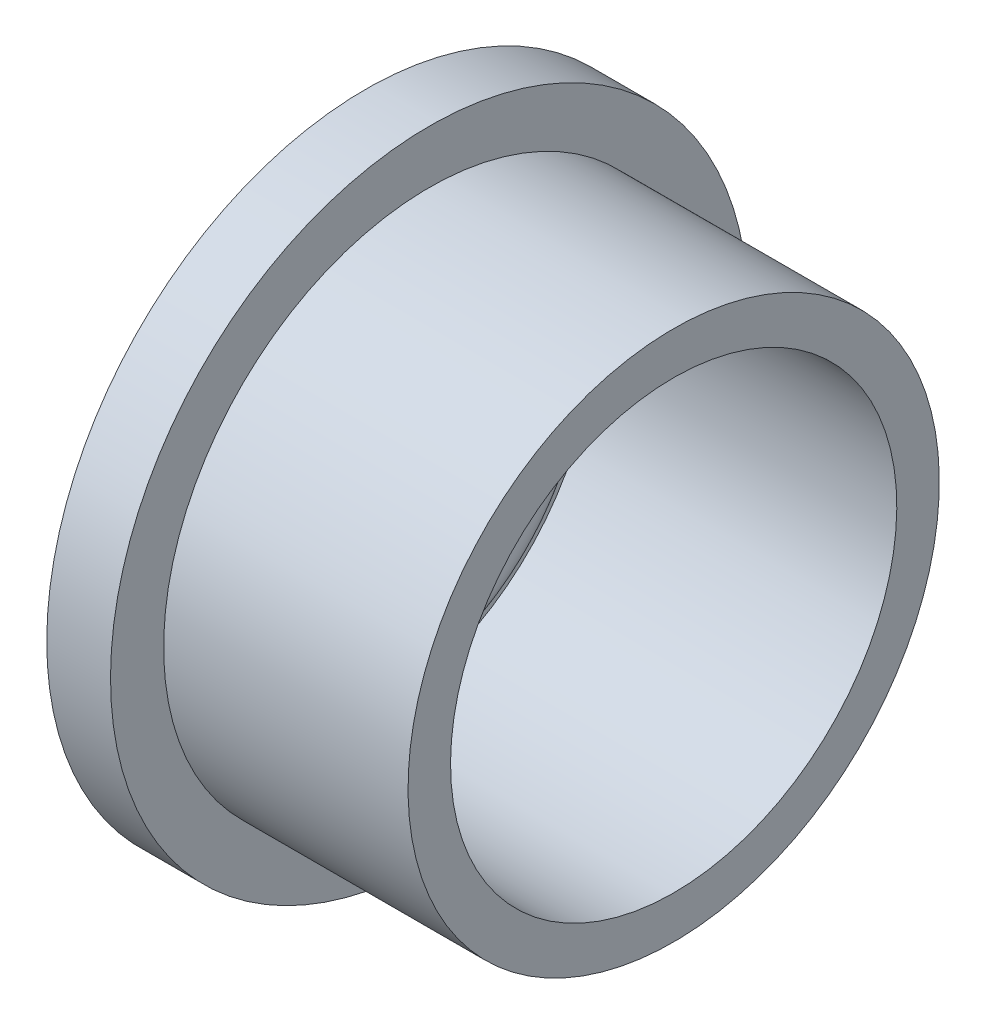
ISO-10303-21;
HEADER;
FILE_DESCRIPTION(('STEP AP214'),'2;1');
FILE_NAME('part.step','',(''),(''),'','','');
FILE_SCHEMA(('AUTOMOTIVE_DESIGN { 1 0 10303 214 1 1 1 1 }'));
ENDSEC;
DATA;
#1=APPLICATION_CONTEXT('core data for automotive mechanical design processes');
#2=APPLICATION_PROTOCOL_DEFINITION('international standard','automotive_design',2000,#1);
#3=PRODUCT_CONTEXT('',#1,'mechanical');
#4=PRODUCT('Part','Part','',(#3));
#5=PRODUCT_RELATED_PRODUCT_CATEGORY('part','',(#4));
#6=PRODUCT_DEFINITION_FORMATION('','',#4);
#7=PRODUCT_DEFINITION_CONTEXT('part definition',#1,'design');
#8=PRODUCT_DEFINITION('design','',#6,#7);
#9=PRODUCT_DEFINITION_SHAPE('','',#8);
#10=(LENGTH_UNIT() NAMED_UNIT(*) SI_UNIT(.MILLI.,.METRE.));
#11=(NAMED_UNIT(*) PLANE_ANGLE_UNIT() SI_UNIT($,.RADIAN.));
#12=(NAMED_UNIT(*) SI_UNIT($,.STERADIAN.) SOLID_ANGLE_UNIT());
#13=UNCERTAINTY_MEASURE_WITH_UNIT(LENGTH_MEASURE(1.E-05),#10,'distance_accuracy_value','');
#14=(GEOMETRIC_REPRESENTATION_CONTEXT(3) GLOBAL_UNCERTAINTY_ASSIGNED_CONTEXT((#13)) GLOBAL_UNIT_ASSIGNED_CONTEXT((#10,
#11,#12)) REPRESENTATION_CONTEXT('',''));
#15=CARTESIAN_POINT('',(0.,0.,0.));
#16=DIRECTION('',(0.,0.,1.));
#17=DIRECTION('',(1.,0.,0.));
#18=AXIS2_PLACEMENT_3D('',#15,#16,#17);
#19=CARTESIAN_POINT('',(7.45,42.9,120.969863647503));
#20=DIRECTION('',(1.,0.,0.));
#21=DIRECTION('',(0.,-0.948451293798745,-0.316922929576715));
#22=AXIS2_PLACEMENT_3D('',#19,#20,#21);
#23=CYLINDRICAL_SURFACE('',#22,1.9);
#24=CARTESIAN_POINT('',(6.,42.9,120.969863647503));
#25=DIRECTION('',(1.,0.,0.));
#26=DIRECTION('',(0.,-0.948451293798745,-0.316922929576715));
#27=AXIS2_PLACEMENT_3D('',#24,#25,#26);
#28=CIRCLE('',#27,1.9);
#29=CARTESIAN_POINT('',(6.,41.0979425417824,120.367710081307));
#30=VERTEX_POINT('',#29);
#31=EDGE_CURVE('E123',#30,#30,#28,.T.);
#32=ORIENTED_EDGE('',*,*,#31,.F.);
#33=EDGE_LOOP('',(#32));
#34=FACE_BOUND('',#33,.T.);
#35=CARTESIAN_POINT('',(6.05,42.9,120.969863647503));
#36=DIRECTION('',(1.,0.,0.));
#37=DIRECTION('',(0.,-0.948451293798745,-0.316922929576715));
#38=AXIS2_PLACEMENT_3D('',#35,#36,#37);
#39=CIRCLE('',#38,1.9);
#40=CARTESIAN_POINT('',(6.05,41.0979425417824,120.367710081307));
#41=VERTEX_POINT('',#40);
#42=EDGE_CURVE('E11',#41,#41,#39,.T.);
#43=ORIENTED_EDGE('',*,*,#42,.T.);
#44=EDGE_LOOP('',(#43));
#45=FACE_BOUND('',#44,.T.);
#46=ADVANCED_FACE('F39',(#34,#45),#23,.F.);
#47=CARTESIAN_POINT('',(6.05,42.9,120.969863647503));
#48=DIRECTION('',(1.,0.,0.));
#49=DIRECTION('',(0.,-0.948451293798745,-0.316922929576715));
#50=AXIS2_PLACEMENT_3D('',#47,#48,#49);
#51=TOROIDAL_SURFACE('',#50,1.8,0.1);
#52=ORIENTED_EDGE('',*,*,#42,.F.);
#53=EDGE_LOOP('',(#52));
#54=FACE_BOUND('',#53,.T.);
#55=CARTESIAN_POINT('',(6.05,42.9,120.969863647503));
#56=DIRECTION('',(1.,0.,0.));
#57=DIRECTION('',(0.,-0.948451293798745,-0.316922929576715));
#58=AXIS2_PLACEMENT_3D('',#55,#56,#57);
#59=CIRCLE('',#58,1.7);
#60=CARTESIAN_POINT('',(6.05,41.2876328005421,120.431094667223));
#61=VERTEX_POINT('',#60);
#62=EDGE_CURVE('E50',#61,#61,#59,.T.);
#63=ORIENTED_EDGE('',*,*,#62,.T.);
#64=EDGE_LOOP('',(#63));
#65=FACE_BOUND('',#64,.T.);
#66=ADVANCED_FACE('F183',(#54,#65),#51,.F.);
#67=CARTESIAN_POINT('',(7.45,42.9,120.969863647503));
#68=DIRECTION('',(1.,0.,0.));
#69=DIRECTION('',(0.,-0.948451293798745,-0.316922929576715));
#70=AXIS2_PLACEMENT_3D('',#67,#68,#69);
#71=CYLINDRICAL_SURFACE('',#70,1.7);
#72=ORIENTED_EDGE('',*,*,#62,.F.);
#73=EDGE_LOOP('',(#72));
#74=FACE_BOUND('',#73,.T.);
#75=CARTESIAN_POINT('',(6.,42.9,120.969863647503));
#76=DIRECTION('',(1.,0.,0.));
#77=DIRECTION('',(0.,-0.948451293798745,-0.316922929576715));
#78=AXIS2_PLACEMENT_3D('',#75,#76,#77);
#79=CIRCLE('',#78,1.7);
#80=CARTESIAN_POINT('',(6.,41.2876328005421,120.431094667223));
#81=VERTEX_POINT('',#80);
#82=EDGE_CURVE('E129',#81,#81,#79,.T.);
#83=ORIENTED_EDGE('',*,*,#82,.T.);
#84=EDGE_LOOP('',(#83));
#85=FACE_BOUND('',#84,.T.);
#86=ADVANCED_FACE('F189',(#74,#85),#71,.T.);
#87=CARTESIAN_POINT('',(6.,44.5123671994579,121.508632627783));
#88=DIRECTION('',(1.,0.,0.));
#89=DIRECTION('',(0.,-0.948451293798745,-0.316922929576715));
#90=AXIS2_PLACEMENT_3D('',#87,#88,#89);
#91=PLANE('',#90);
#92=CARTESIAN_POINT('',(6.,42.9,120.969863647503));
#93=DIRECTION('',(1.,0.,0.));
#94=DIRECTION('',(0.,-0.948451293798745,-0.316922929576715));
#95=AXIS2_PLACEMENT_3D('',#92,#93,#94);
#96=CIRCLE('',#95,1.45);
#97=CARTESIAN_POINT('',(6.,41.5247456239918,120.510325399617));
#98=VERTEX_POINT('',#97);
#99=EDGE_CURVE('E131',#98,#98,#96,.T.);
#100=ORIENTED_EDGE('',*,*,#99,.T.);
#101=EDGE_LOOP('',(#100));
#102=FACE_BOUND('',#101,.T.);
#103=ORIENTED_EDGE('',*,*,#82,.F.);
#104=EDGE_LOOP('',(#103));
#105=FACE_BOUND('',#104,.T.);
#106=ADVANCED_FACE('F200',(#102,#105),#91,.F.);
#107=CARTESIAN_POINT('',(7.45,42.9,120.969863647503));
#108=DIRECTION('',(1.,0.,0.));
#109=DIRECTION('',(0.,-0.948451293798745,-0.316922929576715));
#110=AXIS2_PLACEMENT_3D('',#107,#108,#109);
#111=CYLINDRICAL_SURFACE('',#110,1.45);
#112=ORIENTED_EDGE('',*,*,#99,.F.);
#113=EDGE_LOOP('',(#112));
#114=FACE_BOUND('',#113,.T.);
#115=CARTESIAN_POINT('',(6.05,42.9,120.969863647503));
#116=DIRECTION('',(1.,0.,0.));
#117=DIRECTION('',(0.,-0.948451293798745,-0.316922929576715));
#118=AXIS2_PLACEMENT_3D('',#115,#116,#117);
#119=CIRCLE('',#118,1.45);
#120=CARTESIAN_POINT('',(6.05,41.5247456239918,120.510325399617));
#121=VERTEX_POINT('',#120);
#122=EDGE_CURVE('E120',#121,#121,#119,.T.);
#123=ORIENTED_EDGE('',*,*,#122,.T.);
#124=EDGE_LOOP('',(#123));
#125=FACE_BOUND('',#124,.T.);
#126=ADVANCED_FACE('F41',(#114,#125),#111,.F.);
#127=CARTESIAN_POINT('',(6.05,44.4649446347679,121.492786481305));
#128=DIRECTION('',(-1.,0.,0.));
#129=DIRECTION('',(0.,-0.316922929576715,0.948451293798745));
#130=AXIS2_PLACEMENT_3D('',#127,#128,#129);
#131=PLANE('',#130);
#132=ORIENTED_EDGE('',*,*,#122,.F.);
#133=EDGE_LOOP('',(#132));
#134=FACE_BOUND('',#133,.T.);
#135=CARTESIAN_POINT('',(6.05,42.9,120.969863647503));
#136=DIRECTION('',(1.,0.,0.));
#137=DIRECTION('',(0.,-0.948451293798745,-0.316922929576715));
#138=AXIS2_PLACEMENT_3D('',#135,#136,#137);
#139=CIRCLE('',#138,1.65);
#140=CARTESIAN_POINT('',(6.05,41.3350553652321,120.446940813701));
#141=VERTEX_POINT('',#140);
#142=EDGE_CURVE('E104',#141,#141,#139,.T.);
#143=ORIENTED_EDGE('',*,*,#142,.T.);
#144=EDGE_LOOP('',(#143));
#145=FACE_BOUND('',#144,.T.);
#146=ADVANCED_FACE('F194',(#134,#145),#131,.F.);
#147=CARTESIAN_POINT('',(6.05,42.9,120.969863647503));
#148=DIRECTION('',(1.,0.,0.));
#149=DIRECTION('',(0.,-0.948451293798745,-0.316922929576715));
#150=AXIS2_PLACEMENT_3D('',#147,#148,#149);
#151=TOROIDAL_SURFACE('',#150,1.8,0.15);
#152=ORIENTED_EDGE('',*,*,#142,.F.);
#153=EDGE_LOOP('',(#152));
#154=FACE_BOUND('',#153,.T.);
#155=CARTESIAN_POINT('',(6.05,42.9,120.969863647503));
#156=DIRECTION('',(1.,0.,0.));
#157=DIRECTION('',(0.,-0.948451293798745,-0.316922929576715));
#158=AXIS2_PLACEMENT_3D('',#155,#156,#157);
#159=CIRCLE('',#158,1.95);
#160=CARTESIAN_POINT('',(6.05,41.0505199770924,120.351863934828));
#161=VERTEX_POINT('',#160);
#162=EDGE_CURVE('E110',#161,#161,#159,.T.);
#163=ORIENTED_EDGE('',*,*,#162,.T.);
#164=EDGE_LOOP('',(#163));
#165=FACE_BOUND('',#164,.T.);
#166=ADVANCED_FACE('F111',(#154,#165),#151,.T.);
#167=CARTESIAN_POINT('',(6.05,44.7494800229076,121.587863360178));
#168=DIRECTION('',(-1.,0.,0.));
#169=DIRECTION('',(0.,-0.316922929576715,0.948451293798745));
#170=AXIS2_PLACEMENT_3D('',#167,#168,#169);
#171=PLANE('',#170);
#172=ORIENTED_EDGE('',*,*,#162,.F.);
#173=EDGE_LOOP('',(#172));
#174=FACE_BOUND('',#173,.T.);
#175=CARTESIAN_POINT('',(6.05,42.9,120.969863647503));
#176=DIRECTION('',(1.,0.,0.));
#177=DIRECTION('',(0.,0.948451293798745,0.316922929576715));
#178=AXIS2_PLACEMENT_3D('',#175,#176,#177);
#179=CIRCLE('',#178,2.1);
#180=CARTESIAN_POINT('',(6.05,44.8917477169774,121.635401799614));
#181=VERTEX_POINT('',#180);
#182=EDGE_CURVE('E140',#181,#181,#179,.T.);
#183=ORIENTED_EDGE('',*,*,#182,.T.);
#184=EDGE_LOOP('',(#183));
#185=FACE_BOUND('',#184,.T.);
#186=ADVANCED_FACE('F179',(#174,#185),#171,.F.);
#187=CARTESIAN_POINT('',(6.6,42.9,120.969863647503));
#188=DIRECTION('',(-1.,0.,0.));
#189=DIRECTION('',(0.,-0.316922929576715,0.948451293798745));
#190=AXIS2_PLACEMENT_3D('',#187,#188,#189);
#191=PLANE('',#190);
#192=CARTESIAN_POINT('',(6.6,42.9,120.969863647503));
#193=DIRECTION('',(-1.,0.,0.));
#194=DIRECTION('',(0.,0.948451293798745,0.316922929576715));
#195=AXIS2_PLACEMENT_3D('',#192,#193,#194);
#196=CIRCLE('',#195,2.5);
#197=CARTESIAN_POINT('',(6.6,45.2711282344969,121.762170971445));
#198=VERTEX_POINT('',#197);
#199=EDGE_CURVE('E147',#198,#198,#196,.T.);
#200=ORIENTED_EDGE('',*,*,#199,.T.);
#201=EDGE_LOOP('',(#200));
#202=FACE_BOUND('',#201,.T.);
#203=CARTESIAN_POINT('',(6.6,42.9,120.969863647503));
#204=DIRECTION('',(-1.,0.,0.));
#205=DIRECTION('',(0.,0.948451293798745,0.316922929576715));
#206=AXIS2_PLACEMENT_3D('',#203,#204,#205);
#207=CIRCLE('',#206,3.);
#208=CARTESIAN_POINT('',(6.6,45.7453538813962,121.920632436233));
#209=VERTEX_POINT('',#208);
#210=EDGE_CURVE('E114',#209,#209,#207,.T.);
#211=ORIENTED_EDGE('',*,*,#210,.F.);
#212=EDGE_LOOP('',(#211));
#213=FACE_BOUND('',#212,.T.);
#214=ADVANCED_FACE('F169',(#202,#213),#191,.F.);
#215=CARTESIAN_POINT('',(6.6,42.9,120.969863647503));
#216=DIRECTION('',(-1.,0.,0.));
#217=DIRECTION('',(0.,0.948451293798745,0.316922929576715));
#218=AXIS2_PLACEMENT_3D('',#215,#216,#217);
#219=CYLINDRICAL_SURFACE('',#218,3.);
#220=ORIENTED_EDGE('',*,*,#210,.T.);
#221=EDGE_LOOP('',(#220));
#222=FACE_BOUND('',#221,.T.);
#223=CARTESIAN_POINT('',(6.,42.9,120.969863647503));
#224=DIRECTION('',(-1.,0.,0.));
#225=DIRECTION('',(0.,0.948451293798745,0.316922929576715));
#226=AXIS2_PLACEMENT_3D('',#223,#224,#225);
#227=CIRCLE('',#226,3.);
#228=CARTESIAN_POINT('',(6.,45.7453538813962,121.920632436233));
#229=VERTEX_POINT('',#228);
#230=EDGE_CURVE('E43',#229,#229,#227,.T.);
#231=ORIENTED_EDGE('',*,*,#230,.F.);
#232=EDGE_LOOP('',(#231));
#233=FACE_BOUND('',#232,.T.);
#234=ADVANCED_FACE('F167',(#222,#233),#219,.T.);
#235=CARTESIAN_POINT('',(6.,42.9,120.969863647503));
#236=DIRECTION('',(1.,0.,0.));
#237=DIRECTION('',(0.,-0.948451293798745,-0.316922929576715));
#238=AXIS2_PLACEMENT_3D('',#235,#236,#237);
#239=PLANE('',#238);
#240=ORIENTED_EDGE('',*,*,#31,.T.);
#241=EDGE_LOOP('',(#240));
#242=FACE_BOUND('',#241,.T.);
#243=ORIENTED_EDGE('',*,*,#230,.T.);
#244=EDGE_LOOP('',(#243));
#245=FACE_BOUND('',#244,.T.);
#246=ADVANCED_FACE('F165',(#242,#245),#239,.F.);
#247=CARTESIAN_POINT('',(8.9,42.9,120.969863647503));
#248=DIRECTION('',(1.,0.,0.));
#249=DIRECTION('',(0.,-0.948451293798745,-0.316922929576715));
#250=AXIS2_PLACEMENT_3D('',#247,#248,#249);
#251=PLANE('',#250);
#252=CARTESIAN_POINT('',(8.9,42.9,120.969863647503));
#253=DIRECTION('',(1.,0.,0.));
#254=DIRECTION('',(0.,-0.948451293798745,-0.316922929576715));
#255=AXIS2_PLACEMENT_3D('',#252,#253,#254);
#256=CIRCLE('',#255,2.1);
#257=CARTESIAN_POINT('',(8.9,40.9082522830226,120.304325495392));
#258=VERTEX_POINT('',#257);
#259=EDGE_CURVE('E142',#258,#258,#256,.T.);
#260=ORIENTED_EDGE('',*,*,#259,.F.);
#261=EDGE_LOOP('',(#260));
#262=FACE_BOUND('',#261,.T.);
#263=CARTESIAN_POINT('',(8.9,42.9,120.969863647503));
#264=DIRECTION('',(1.,0.,0.));
#265=DIRECTION('',(0.,-0.948451293798745,-0.316922929576715));
#266=AXIS2_PLACEMENT_3D('',#263,#264,#265);
#267=CIRCLE('',#266,2.5);
#268=CARTESIAN_POINT('',(8.9,40.5288717655031,120.177556323561));
#269=VERTEX_POINT('',#268);
#270=EDGE_CURVE('E127',#269,#269,#267,.T.);
#271=ORIENTED_EDGE('',*,*,#270,.T.);
#272=EDGE_LOOP('',(#271));
#273=FACE_BOUND('',#272,.T.);
#274=ADVANCED_FACE('F176',(#262,#273),#251,.T.);
#275=CARTESIAN_POINT('',(8.9,42.9,120.969863647503));
#276=DIRECTION('',(-1.,0.,0.));
#277=DIRECTION('',(0.,0.948451293798745,0.316922929576715));
#278=AXIS2_PLACEMENT_3D('',#275,#276,#277);
#279=CYLINDRICAL_SURFACE('',#278,2.5);
#280=ORIENTED_EDGE('',*,*,#270,.F.);
#281=EDGE_LOOP('',(#280));
#282=FACE_BOUND('',#281,.T.);
#283=ORIENTED_EDGE('',*,*,#199,.F.);
#284=EDGE_LOOP('',(#283));
#285=FACE_BOUND('',#284,.T.);
#286=ADVANCED_FACE('F205',(#282,#285),#279,.T.);
#287=CARTESIAN_POINT('',(6.,42.9,120.969863647503));
#288=DIRECTION('',(1.,0.,0.));
#289=DIRECTION('',(0.,-0.948451293798745,-0.316922929576715));
#290=AXIS2_PLACEMENT_3D('',#287,#288,#289);
#291=CYLINDRICAL_SURFACE('',#290,2.1);
#292=ORIENTED_EDGE('',*,*,#259,.T.);
#293=EDGE_LOOP('',(#292));
#294=FACE_BOUND('',#293,.T.);
#295=ORIENTED_EDGE('',*,*,#182,.F.);
#296=EDGE_LOOP('',(#295));
#297=FACE_BOUND('',#296,.T.);
#298=ADVANCED_FACE('F208',(#294,#297),#291,.F.);
#299=CLOSED_SHELL('',(#46,#66,#86,#106,#126,#146,#166,#186,#214,#234,#246,#274,#286,#298));
#300=MANIFOLD_SOLID_BREP('B2',#299);
#301=ADVANCED_BREP_SHAPE_REPRESENTATION('',(#18,#300),#14);
#302=SHAPE_DEFINITION_REPRESENTATION(#9,#301);
ENDSEC;
END-ISO-10303-21;
